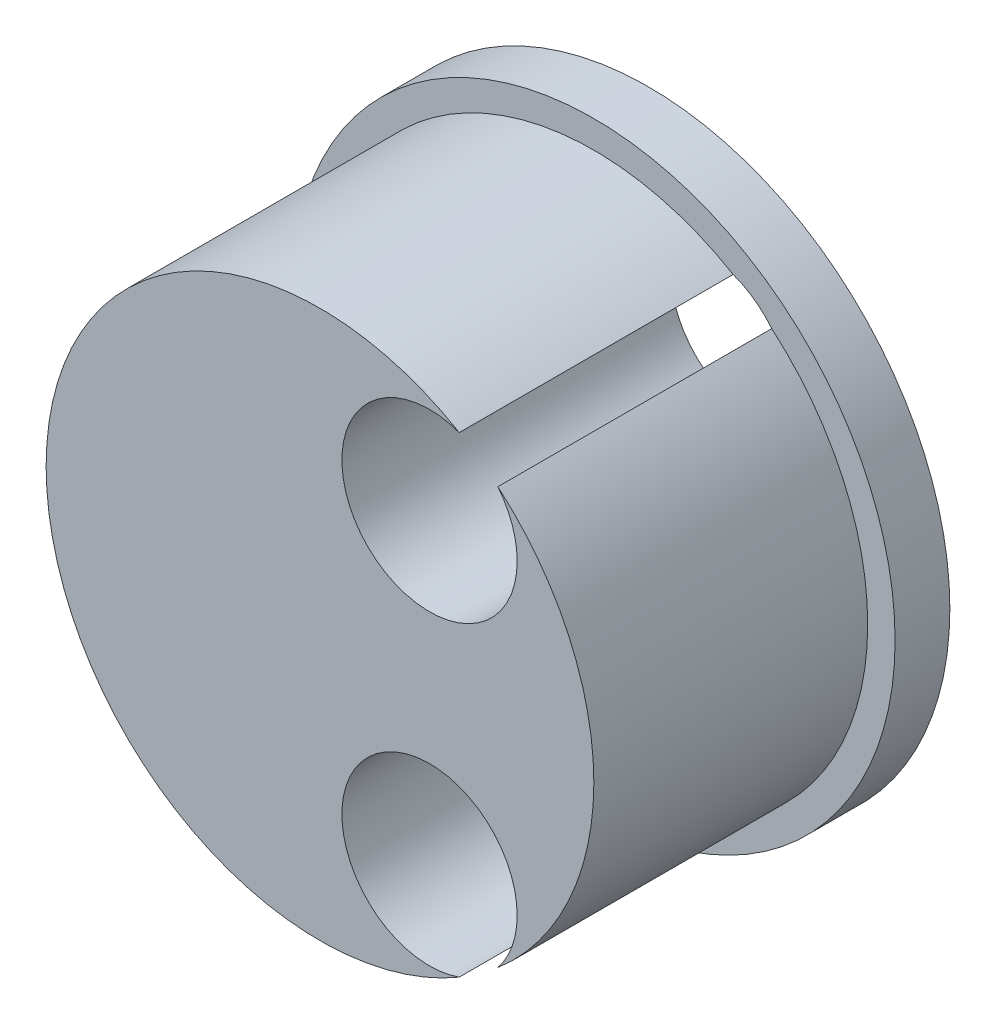
ISO-10303-21;
HEADER;
FILE_DESCRIPTION(('STEP AP214'),'2;1');
FILE_NAME('part.step','',(''),(''),'','','');
FILE_SCHEMA(('AUTOMOTIVE_DESIGN { 1 0 10303 214 1 1 1 1 }'));
ENDSEC;
DATA;
#1=APPLICATION_CONTEXT('core data for automotive mechanical design processes');
#2=APPLICATION_PROTOCOL_DEFINITION('international standard','automotive_design',2000,#1);
#3=PRODUCT_CONTEXT('',#1,'mechanical');
#4=PRODUCT('Part','Part','',(#3));
#5=PRODUCT_RELATED_PRODUCT_CATEGORY('part','',(#4));
#6=PRODUCT_DEFINITION_FORMATION('','',#4);
#7=PRODUCT_DEFINITION_CONTEXT('part definition',#1,'design');
#8=PRODUCT_DEFINITION('design','',#6,#7);
#9=PRODUCT_DEFINITION_SHAPE('','',#8);
#10=(LENGTH_UNIT() NAMED_UNIT(*) SI_UNIT(.MILLI.,.METRE.));
#11=(NAMED_UNIT(*) PLANE_ANGLE_UNIT() SI_UNIT($,.RADIAN.));
#12=(NAMED_UNIT(*) SI_UNIT($,.STERADIAN.) SOLID_ANGLE_UNIT());
#13=UNCERTAINTY_MEASURE_WITH_UNIT(LENGTH_MEASURE(1.E-05),#10,'distance_accuracy_value','');
#14=(GEOMETRIC_REPRESENTATION_CONTEXT(3) GLOBAL_UNCERTAINTY_ASSIGNED_CONTEXT((#13)) GLOBAL_UNIT_ASSIGNED_CONTEXT((#10,
#11,#12)) REPRESENTATION_CONTEXT('',''));
#15=CARTESIAN_POINT('',(0.,0.,0.));
#16=DIRECTION('',(0.,0.,1.));
#17=DIRECTION('',(1.,0.,0.));
#18=AXIS2_PLACEMENT_3D('',#15,#16,#17);
#19=CARTESIAN_POINT('',(0.,0.,8.5));
#20=DIRECTION('',(0.,0.,1.));
#21=DIRECTION('',(1.,0.,0.));
#22=AXIS2_PLACEMENT_3D('',#19,#20,#21);
#23=PLANE('',#22);
#24=CARTESIAN_POINT('',(0.,2.8,8.5));
#25=DIRECTION('',(0.,0.,1.));
#26=DIRECTION('',(1.,0.,0.));
#27=AXIS2_PLACEMENT_3D('',#24,#25,#26);
#28=CIRCLE('',#27,1.6);
#29=CARTESIAN_POINT('',(1.6,2.8,8.5));
#30=VERTEX_POINT('',#29);
#31=EDGE_CURVE('E113',#30,#30,#28,.T.);
#32=ORIENTED_EDGE('',*,*,#31,.T.);
#33=EDGE_LOOP('',(#32));
#34=FACE_BOUND('',#33,.T.);
#35=CARTESIAN_POINT('',(0.,-2.8,8.5));
#36=DIRECTION('',(0.,0.,1.));
#37=DIRECTION('',(1.,0.,0.));
#38=AXIS2_PLACEMENT_3D('',#35,#36,#37);
#39=CIRCLE('',#38,1.6);
#40=CARTESIAN_POINT('',(1.6,-2.8,8.5));
#41=VERTEX_POINT('',#40);
#42=EDGE_CURVE('E95',#41,#41,#39,.T.);
#43=ORIENTED_EDGE('',*,*,#42,.T.);
#44=EDGE_LOOP('',(#43));
#45=FACE_BOUND('',#44,.T.);
#46=CARTESIAN_POINT('',(-2.,0.,8.5));
#47=DIRECTION('',(0.,0.,1.));
#48=DIRECTION('',(1.,0.,0.));
#49=AXIS2_PLACEMENT_3D('',#46,#47,#48);
#50=CIRCLE('',#49,5.5);
#51=CARTESIAN_POINT('',(3.5,0.,8.5));
#52=VERTEX_POINT('',#51);
#53=EDGE_CURVE('E150',#52,#52,#50,.T.);
#54=ORIENTED_EDGE('',*,*,#53,.F.);
#55=EDGE_LOOP('',(#54));
#56=FACE_BOUND('',#55,.T.);
#57=ADVANCED_FACE('F40',(#34,#45,#56),#23,.F.);
#58=CARTESIAN_POINT('',(0.,0.,14.5));
#59=DIRECTION('',(0.,0.,-1.));
#60=DIRECTION('',(-1.,0.,0.));
#61=AXIS2_PLACEMENT_3D('',#58,#59,#60);
#62=PLANE('',#61);
#63=CARTESIAN_POINT('',(-2.,0.,14.5));
#64=DIRECTION('',(0.,0.,1.));
#65=DIRECTION('',(1.,0.,0.));
#66=AXIS2_PLACEMENT_3D('',#63,#64,#65);
#67=CIRCLE('',#66,5.);
#68=CARTESIAN_POINT('',(1.24765894169533,-3.80167218450334,14.5));
#69=VERTEX_POINT('',#68);
#70=CARTESIAN_POINT('',(1.24765894169533,3.80167218450334,14.5));
#71=VERTEX_POINT('',#70);
#72=EDGE_CURVE('E89',#69,#71,#67,.T.);
#73=ORIENTED_EDGE('',*,*,#72,.T.);
#74=CARTESIAN_POINT('',(0.,2.8,14.5));
#75=DIRECTION('',(0.,0.,-1.));
#76=DIRECTION('',(-1.,0.,0.));
#77=AXIS2_PLACEMENT_3D('',#74,#75,#76);
#78=CIRCLE('',#77,1.6);
#79=CARTESIAN_POINT('',(0.542881598845211,4.30508457225342,14.5));
#80=VERTEX_POINT('',#79);
#81=EDGE_CURVE('E84',#80,#71,#78,.F.);
#82=ORIENTED_EDGE('',*,*,#81,.F.);
#83=CARTESIAN_POINT('',(0.542881598845213,-4.30508457225342,14.5));
#84=VERTEX_POINT('',#83);
#85=EDGE_CURVE('E44',#80,#84,#67,.T.);
#86=ORIENTED_EDGE('',*,*,#85,.T.);
#87=CARTESIAN_POINT('',(0.,-2.8,14.5));
#88=DIRECTION('',(0.,0.,-1.));
#89=DIRECTION('',(-1.,0.,0.));
#90=AXIS2_PLACEMENT_3D('',#87,#88,#89);
#91=CIRCLE('',#90,1.6);
#92=EDGE_CURVE('E82',#69,#84,#91,.F.);
#93=ORIENTED_EDGE('',*,*,#92,.F.);
#94=EDGE_LOOP('',(#73,#82,#86,#93));
#95=FACE_BOUND('',#94,.T.);
#96=ADVANCED_FACE('F81',(#95),#62,.F.);
#97=CARTESIAN_POINT('',(-2.,0.,9.5));
#98=DIRECTION('',(0.,0.,1.));
#99=DIRECTION('',(1.,0.,0.));
#100=AXIS2_PLACEMENT_3D('',#97,#98,#99);
#101=PLANE('',#100);
#102=CARTESIAN_POINT('',(0.,2.8,9.5));
#103=DIRECTION('',(0.,0.,1.));
#104=DIRECTION('',(1.,0.,0.));
#105=AXIS2_PLACEMENT_3D('',#102,#103,#104);
#106=CIRCLE('',#105,1.6);
#107=CARTESIAN_POINT('',(1.24765894169533,3.80167218450334,9.5));
#108=VERTEX_POINT('',#107);
#109=CARTESIAN_POINT('',(0.542881598845211,4.30508457225342,9.5));
#110=VERTEX_POINT('',#109);
#111=EDGE_CURVE('E110',#108,#110,#106,.T.);
#112=ORIENTED_EDGE('',*,*,#111,.F.);
#113=CARTESIAN_POINT('',(-2.,0.,9.5));
#114=DIRECTION('',(0.,0.,1.));
#115=DIRECTION('',(1.,0.,0.));
#116=AXIS2_PLACEMENT_3D('',#113,#114,#115);
#117=CIRCLE('',#116,5.);
#118=CARTESIAN_POINT('',(1.24765894169533,-3.80167218450333,9.5));
#119=VERTEX_POINT('',#118);
#120=EDGE_CURVE('E109',#119,#108,#117,.T.);
#121=ORIENTED_EDGE('',*,*,#120,.F.);
#122=CARTESIAN_POINT('',(0.,-2.8,9.5));
#123=DIRECTION('',(0.,0.,1.));
#124=DIRECTION('',(1.,0.,0.));
#125=AXIS2_PLACEMENT_3D('',#122,#123,#124);
#126=CIRCLE('',#125,1.6);
#127=CARTESIAN_POINT('',(0.542881598845214,-4.30508457225342,9.5));
#128=VERTEX_POINT('',#127);
#129=EDGE_CURVE('E57',#128,#119,#126,.T.);
#130=ORIENTED_EDGE('',*,*,#129,.F.);
#131=EDGE_CURVE('E93',#110,#128,#117,.T.);
#132=ORIENTED_EDGE('',*,*,#131,.F.);
#133=EDGE_LOOP('',(#112,#121,#130,#132));
#134=FACE_BOUND('',#133,.T.);
#135=CARTESIAN_POINT('',(-2.,0.,9.5));
#136=DIRECTION('',(0.,0.,1.));
#137=DIRECTION('',(1.,0.,0.));
#138=AXIS2_PLACEMENT_3D('',#135,#136,#137);
#139=CIRCLE('',#138,5.5);
#140=CARTESIAN_POINT('',(3.5,0.,9.5));
#141=VERTEX_POINT('',#140);
#142=EDGE_CURVE('E88',#141,#141,#139,.T.);
#143=ORIENTED_EDGE('',*,*,#142,.T.);
#144=EDGE_LOOP('',(#143));
#145=FACE_BOUND('',#144,.T.);
#146=ADVANCED_FACE('F136',(#134,#145),#101,.T.);
#147=CARTESIAN_POINT('',(-2.,0.,14.5));
#148=DIRECTION('',(0.,0.,-1.));
#149=DIRECTION('',(-1.,0.,0.));
#150=AXIS2_PLACEMENT_3D('',#147,#148,#149);
#151=CYLINDRICAL_SURFACE('',#150,5.);
#152=ORIENTED_EDGE('',*,*,#120,.T.);
#153=DIRECTION('',(0.,0.,1.));
#154=VECTOR('',#153,1.);
#155=CARTESIAN_POINT('',(1.24765894169533,3.80167218450334,8.5));
#156=LINE('',#155,#154);
#157=EDGE_CURVE('E102',#108,#71,#156,.T.);
#158=ORIENTED_EDGE('',*,*,#157,.T.);
#159=ORIENTED_EDGE('',*,*,#72,.F.);
#160=DIRECTION('',(0.,0.,1.));
#161=VECTOR('',#160,1.);
#162=CARTESIAN_POINT('',(1.24765894169533,-3.80167218450334,8.5));
#163=LINE('',#162,#161);
#164=EDGE_CURVE('E11',#69,#119,#163,.F.);
#165=ORIENTED_EDGE('',*,*,#164,.T.);
#166=EDGE_LOOP('',(#152,#158,#159,#165));
#167=FACE_BOUND('',#166,.T.);
#168=ADVANCED_FACE('F107',(#167),#151,.T.);
#169=ORIENTED_EDGE('',*,*,#85,.F.);
#170=DIRECTION('',(0.,0.,1.));
#171=VECTOR('',#170,1.);
#172=CARTESIAN_POINT('',(0.542881598845211,4.30508457225342,8.5));
#173=LINE('',#172,#171);
#174=EDGE_CURVE('E104',#80,#110,#173,.F.);
#175=ORIENTED_EDGE('',*,*,#174,.T.);
#176=ORIENTED_EDGE('',*,*,#131,.T.);
#177=DIRECTION('',(0.,0.,1.));
#178=VECTOR('',#177,1.);
#179=CARTESIAN_POINT('',(0.542881598845213,-4.30508457225342,8.5));
#180=LINE('',#179,#178);
#181=EDGE_CURVE('E49',#128,#84,#180,.T.);
#182=ORIENTED_EDGE('',*,*,#181,.T.);
#183=EDGE_LOOP('',(#169,#175,#176,#182));
#184=FACE_BOUND('',#183,.T.);
#185=ADVANCED_FACE('F91',(#184),#151,.T.);
#186=CARTESIAN_POINT('',(0.,2.8,-2.));
#187=DIRECTION('',(0.,0.,1.));
#188=DIRECTION('',(1.,0.,0.));
#189=AXIS2_PLACEMENT_3D('',#186,#187,#188);
#190=CYLINDRICAL_SURFACE('',#189,1.6);
#191=ORIENTED_EDGE('',*,*,#31,.F.);
#192=EDGE_LOOP('',(#191));
#193=FACE_BOUND('',#192,.T.);
#194=ORIENTED_EDGE('',*,*,#174,.F.);
#195=ORIENTED_EDGE('',*,*,#81,.T.);
#196=ORIENTED_EDGE('',*,*,#157,.F.);
#197=ORIENTED_EDGE('',*,*,#111,.T.);
#198=EDGE_LOOP('',(#194,#195,#196,#197));
#199=FACE_BOUND('',#198,.T.);
#200=ADVANCED_FACE('F100',(#193,#199),#190,.F.);
#201=CARTESIAN_POINT('',(0.,-2.8,-2.));
#202=DIRECTION('',(0.,0.,1.));
#203=DIRECTION('',(1.,0.,0.));
#204=AXIS2_PLACEMENT_3D('',#201,#202,#203);
#205=CYLINDRICAL_SURFACE('',#204,1.6);
#206=ORIENTED_EDGE('',*,*,#42,.F.);
#207=EDGE_LOOP('',(#206));
#208=FACE_BOUND('',#207,.T.);
#209=ORIENTED_EDGE('',*,*,#164,.F.);
#210=ORIENTED_EDGE('',*,*,#92,.T.);
#211=ORIENTED_EDGE('',*,*,#181,.F.);
#212=ORIENTED_EDGE('',*,*,#129,.T.);
#213=EDGE_LOOP('',(#209,#210,#211,#212));
#214=FACE_BOUND('',#213,.T.);
#215=ADVANCED_FACE('F42',(#208,#214),#205,.F.);
#216=CARTESIAN_POINT('',(-2.,0.,9.5));
#217=DIRECTION('',(0.,0.,-1.));
#218=DIRECTION('',(-1.,0.,0.));
#219=AXIS2_PLACEMENT_3D('',#216,#217,#218);
#220=CYLINDRICAL_SURFACE('',#219,5.5);
#221=ORIENTED_EDGE('',*,*,#142,.F.);
#222=EDGE_LOOP('',(#221));
#223=FACE_BOUND('',#222,.T.);
#224=ORIENTED_EDGE('',*,*,#53,.T.);
#225=EDGE_LOOP('',(#224));
#226=FACE_BOUND('',#225,.T.);
#227=ADVANCED_FACE('F122',(#223,#226),#220,.T.);
#228=CLOSED_SHELL('',(#57,#96,#146,#168,#185,#200,#215,#227));
#229=MANIFOLD_SOLID_BREP('B2',#228);
#230=ADVANCED_BREP_SHAPE_REPRESENTATION('',(#18,#229),#14);
#231=SHAPE_DEFINITION_REPRESENTATION(#9,#230);
ENDSEC;
END-ISO-10303-21;
